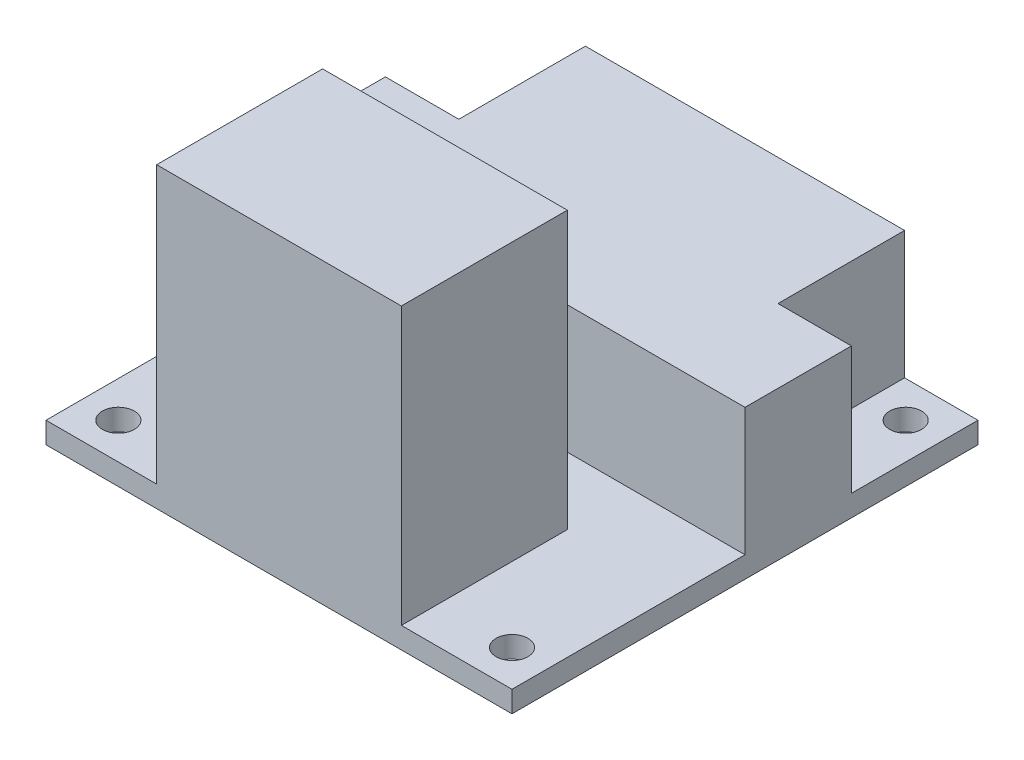
ISO-10303-21;
HEADER;
FILE_DESCRIPTION(('STEP AP214'),'2;1');
FILE_NAME('part.step','',(''),(''),'','','');
FILE_SCHEMA(('AUTOMOTIVE_DESIGN { 1 0 10303 214 1 1 1 1 }'));
ENDSEC;
DATA;
#1=APPLICATION_CONTEXT('core data for automotive mechanical design processes');
#2=APPLICATION_PROTOCOL_DEFINITION('international standard','automotive_design',2000,#1);
#3=PRODUCT_CONTEXT('',#1,'mechanical');
#4=PRODUCT('Part','Part','',(#3));
#5=PRODUCT_RELATED_PRODUCT_CATEGORY('part','',(#4));
#6=PRODUCT_DEFINITION_FORMATION('','',#4);
#7=PRODUCT_DEFINITION_CONTEXT('part definition',#1,'design');
#8=PRODUCT_DEFINITION('design','',#6,#7);
#9=PRODUCT_DEFINITION_SHAPE('','',#8);
#10=(LENGTH_UNIT() NAMED_UNIT(*) SI_UNIT(.MILLI.,.METRE.));
#11=(NAMED_UNIT(*) PLANE_ANGLE_UNIT() SI_UNIT($,.RADIAN.));
#12=(NAMED_UNIT(*) SI_UNIT($,.STERADIAN.) SOLID_ANGLE_UNIT());
#13=UNCERTAINTY_MEASURE_WITH_UNIT(LENGTH_MEASURE(1.E-05),#10,'distance_accuracy_value','');
#14=(GEOMETRIC_REPRESENTATION_CONTEXT(3) GLOBAL_UNCERTAINTY_ASSIGNED_CONTEXT((#13)) GLOBAL_UNIT_ASSIGNED_CONTEXT((#10,
#11,#12)) REPRESENTATION_CONTEXT('',''));
#15=CARTESIAN_POINT('',(0.,0.,0.));
#16=DIRECTION('',(0.,0.,1.));
#17=DIRECTION('',(1.,0.,0.));
#18=AXIS2_PLACEMENT_3D('',#15,#16,#17);
#19=CARTESIAN_POINT('',(0.,2.,0.));
#20=DIRECTION('',(0.,-1.,0.));
#21=DIRECTION('',(0.,0.,-1.));
#22=AXIS2_PLACEMENT_3D('',#19,#20,#21);
#23=PLANE('',#22);
#24=CARTESIAN_POINT('',(-18.5,2.,18.5));
#25=DIRECTION('',(0.,1.,0.));
#26=DIRECTION('',(0.,0.,1.));
#27=AXIS2_PLACEMENT_3D('',#24,#25,#26);
#28=CIRCLE('',#27,1.5);
#29=CARTESIAN_POINT('',(-18.5,2.,20.));
#30=VERTEX_POINT('',#29);
#31=EDGE_CURVE('E215',#30,#30,#28,.T.);
#32=ORIENTED_EDGE('',*,*,#31,.F.);
#33=EDGE_LOOP('',(#32));
#34=FACE_BOUND('',#33,.T.);
#35=CARTESIAN_POINT('',(18.5,2.,18.5));
#36=DIRECTION('',(0.,1.,0.));
#37=DIRECTION('',(0.,0.,1.));
#38=AXIS2_PLACEMENT_3D('',#35,#36,#37);
#39=CIRCLE('',#38,1.5);
#40=CARTESIAN_POINT('',(18.5,2.,20.));
#41=VERTEX_POINT('',#40);
#42=EDGE_CURVE('E209',#41,#41,#39,.T.);
#43=ORIENTED_EDGE('',*,*,#42,.F.);
#44=EDGE_LOOP('',(#43));
#45=FACE_BOUND('',#44,.T.);
#46=DIRECTION('',(1.,0.,0.));
#47=VECTOR('',#46,1.);
#48=CARTESIAN_POINT('',(0.,2.,0.));
#49=LINE('',#48,#47);
#50=CARTESIAN_POINT('',(-21.9,2.,0.));
#51=VERTEX_POINT('',#50);
#52=CARTESIAN_POINT('',(21.9,2.,0.));
#53=VERTEX_POINT('',#52);
#54=EDGE_CURVE('E277',#51,#53,#49,.T.);
#55=ORIENTED_EDGE('',*,*,#54,.F.);
#56=DIRECTION('',(0.,0.,1.));
#57=VECTOR('',#56,1.);
#58=CARTESIAN_POINT('',(-21.9,2.,21.9));
#59=LINE('',#58,#57);
#60=CARTESIAN_POINT('',(-21.9,2.,21.9));
#61=VERTEX_POINT('',#60);
#62=EDGE_CURVE('E171',#51,#61,#59,.T.);
#63=ORIENTED_EDGE('',*,*,#62,.T.);
#64=DIRECTION('',(1.,0.,0.));
#65=VECTOR('',#64,1.);
#66=CARTESIAN_POINT('',(-21.9,2.,21.9));
#67=LINE('',#66,#65);
#68=CARTESIAN_POINT('',(-11.5,2.,21.9));
#69=VERTEX_POINT('',#68);
#70=EDGE_CURVE('E242',#61,#69,#67,.T.);
#71=ORIENTED_EDGE('',*,*,#70,.T.);
#72=DIRECTION('',(0.,0.,1.));
#73=VECTOR('',#72,1.);
#74=CARTESIAN_POINT('',(-11.5,2.,21.9));
#75=LINE('',#74,#73);
#76=CARTESIAN_POINT('',(-11.5,2.,6.3));
#77=VERTEX_POINT('',#76);
#78=EDGE_CURVE('E186',#77,#69,#75,.T.);
#79=ORIENTED_EDGE('',*,*,#78,.F.);
#80=DIRECTION('',(-1.,0.,0.));
#81=VECTOR('',#80,1.);
#82=CARTESIAN_POINT('',(-11.5,2.,6.3));
#83=LINE('',#82,#81);
#84=CARTESIAN_POINT('',(11.5,2.,6.3));
#85=VERTEX_POINT('',#84);
#86=EDGE_CURVE('E176',#85,#77,#83,.T.);
#87=ORIENTED_EDGE('',*,*,#86,.F.);
#88=DIRECTION('',(0.,0.,-1.));
#89=VECTOR('',#88,1.);
#90=CARTESIAN_POINT('',(11.5,2.,21.9));
#91=LINE('',#90,#89);
#92=CARTESIAN_POINT('',(11.5,2.,21.9));
#93=VERTEX_POINT('',#92);
#94=EDGE_CURVE('E173',#93,#85,#91,.T.);
#95=ORIENTED_EDGE('',*,*,#94,.F.);
#96=CARTESIAN_POINT('',(21.9,2.,21.9));
#97=VERTEX_POINT('',#96);
#98=EDGE_CURVE('E241',#93,#97,#67,.T.);
#99=ORIENTED_EDGE('',*,*,#98,.T.);
#100=DIRECTION('',(0.,0.,-1.));
#101=VECTOR('',#100,1.);
#102=CARTESIAN_POINT('',(21.9,2.,21.9));
#103=LINE('',#102,#101);
#104=EDGE_CURVE('E233',#97,#53,#103,.T.);
#105=ORIENTED_EDGE('',*,*,#104,.T.);
#106=EDGE_LOOP('',(#55,#63,#71,#79,#87,#95,#99,#105));
#107=FACE_BOUND('',#106,.T.);
#108=ADVANCED_FACE('F34',(#34,#45,#107),#23,.F.);
#109=CARTESIAN_POINT('',(18.5,2.,-18.5));
#110=DIRECTION('',(0.,1.,0.));
#111=DIRECTION('',(0.,0.,1.));
#112=AXIS2_PLACEMENT_3D('',#109,#110,#111);
#113=CIRCLE('',#112,1.5);
#114=CARTESIAN_POINT('',(18.5,2.,-17.));
#115=VERTEX_POINT('',#114);
#116=EDGE_CURVE('E227',#115,#115,#113,.T.);
#117=ORIENTED_EDGE('',*,*,#116,.F.);
#118=EDGE_LOOP('',(#117));
#119=FACE_BOUND('',#118,.T.);
#120=DIRECTION('',(0.,0.,-1.));
#121=VECTOR('',#120,1.);
#122=CARTESIAN_POINT('',(15.,2.,0.));
#123=LINE('',#122,#121);
#124=CARTESIAN_POINT('',(15.,2.,-10.));
#125=VERTEX_POINT('',#124);
#126=CARTESIAN_POINT('',(15.,2.,-21.9));
#127=VERTEX_POINT('',#126);
#128=EDGE_CURVE('E49',#125,#127,#123,.T.);
#129=ORIENTED_EDGE('',*,*,#128,.F.);
#130=DIRECTION('',(1.,0.,0.));
#131=VECTOR('',#130,1.);
#132=CARTESIAN_POINT('',(0.,2.,-10.));
#133=LINE('',#132,#131);
#134=CARTESIAN_POINT('',(21.9,2.,-10.));
#135=VERTEX_POINT('',#134);
#136=EDGE_CURVE('E278',#125,#135,#133,.T.);
#137=ORIENTED_EDGE('',*,*,#136,.T.);
#138=CARTESIAN_POINT('',(21.9,2.,-21.9));
#139=VERTEX_POINT('',#138);
#140=EDGE_CURVE('E236',#135,#139,#103,.T.);
#141=ORIENTED_EDGE('',*,*,#140,.T.);
#142=DIRECTION('',(-1.,0.,0.));
#143=VECTOR('',#142,1.);
#144=CARTESIAN_POINT('',(-21.9,2.,-21.9));
#145=LINE('',#144,#143);
#146=EDGE_CURVE('E237',#139,#127,#145,.T.);
#147=ORIENTED_EDGE('',*,*,#146,.T.);
#148=EDGE_LOOP('',(#129,#137,#141,#147));
#149=FACE_BOUND('',#148,.T.);
#150=ADVANCED_FACE('F309',(#119,#149),#23,.F.);
#151=CARTESIAN_POINT('',(-18.5,2.,-18.5));
#152=DIRECTION('',(0.,1.,0.));
#153=DIRECTION('',(0.,0.,1.));
#154=AXIS2_PLACEMENT_3D('',#151,#152,#153);
#155=CIRCLE('',#154,1.5);
#156=CARTESIAN_POINT('',(-18.5,2.,-17.));
#157=VERTEX_POINT('',#156);
#158=EDGE_CURVE('E221',#157,#157,#155,.T.);
#159=ORIENTED_EDGE('',*,*,#158,.F.);
#160=EDGE_LOOP('',(#159));
#161=FACE_BOUND('',#160,.T.);
#162=DIRECTION('',(1.,0.,0.));
#163=VECTOR('',#162,1.);
#164=CARTESIAN_POINT('',(0.,2.,-10.));
#165=LINE('',#164,#163);
#166=CARTESIAN_POINT('',(-21.9,2.,-10.));
#167=VERTEX_POINT('',#166);
#168=CARTESIAN_POINT('',(-15.,2.,-10.));
#169=VERTEX_POINT('',#168);
#170=EDGE_CURVE('E57',#167,#169,#165,.T.);
#171=ORIENTED_EDGE('',*,*,#170,.T.);
#172=DIRECTION('',(0.,0.,-1.));
#173=VECTOR('',#172,1.);
#174=CARTESIAN_POINT('',(-15.,2.,0.));
#175=LINE('',#174,#173);
#176=CARTESIAN_POINT('',(-15.,2.,-21.9));
#177=VERTEX_POINT('',#176);
#178=EDGE_CURVE('E285',#169,#177,#175,.T.);
#179=ORIENTED_EDGE('',*,*,#178,.T.);
#180=CARTESIAN_POINT('',(-21.9,2.,-21.9));
#181=VERTEX_POINT('',#180);
#182=EDGE_CURVE('E235',#177,#181,#145,.T.);
#183=ORIENTED_EDGE('',*,*,#182,.T.);
#184=EDGE_CURVE('E239',#181,#167,#59,.T.);
#185=ORIENTED_EDGE('',*,*,#184,.T.);
#186=EDGE_LOOP('',(#171,#179,#183,#185));
#187=FACE_BOUND('',#186,.T.);
#188=ADVANCED_FACE('F330',(#161,#187),#23,.F.);
#189=CARTESIAN_POINT('',(0.,0.,0.));
#190=DIRECTION('',(0.,-1.,0.));
#191=DIRECTION('',(0.,0.,-1.));
#192=AXIS2_PLACEMENT_3D('',#189,#190,#191);
#193=PLANE('',#192);
#194=CARTESIAN_POINT('',(-18.5,0.,18.5));
#195=DIRECTION('',(0.,1.,0.));
#196=DIRECTION('',(0.,0.,1.));
#197=AXIS2_PLACEMENT_3D('',#194,#195,#196);
#198=CIRCLE('',#197,1.5);
#199=CARTESIAN_POINT('',(-18.5,0.,20.));
#200=VERTEX_POINT('',#199);
#201=EDGE_CURVE('E212',#200,#200,#198,.T.);
#202=ORIENTED_EDGE('',*,*,#201,.T.);
#203=EDGE_LOOP('',(#202));
#204=FACE_BOUND('',#203,.T.);
#205=CARTESIAN_POINT('',(18.5,0.,-18.5));
#206=DIRECTION('',(0.,1.,0.));
#207=DIRECTION('',(0.,0.,1.));
#208=AXIS2_PLACEMENT_3D('',#205,#206,#207);
#209=CIRCLE('',#208,1.5);
#210=CARTESIAN_POINT('',(18.5,0.,-17.));
#211=VERTEX_POINT('',#210);
#212=EDGE_CURVE('E224',#211,#211,#209,.T.);
#213=ORIENTED_EDGE('',*,*,#212,.T.);
#214=EDGE_LOOP('',(#213));
#215=FACE_BOUND('',#214,.T.);
#216=DIRECTION('',(0.,0.,-1.));
#217=VECTOR('',#216,1.);
#218=CARTESIAN_POINT('',(21.9,0.,21.9));
#219=LINE('',#218,#217);
#220=CARTESIAN_POINT('',(21.9,0.,21.9));
#221=VERTEX_POINT('',#220);
#222=CARTESIAN_POINT('',(21.9,0.,-21.9));
#223=VERTEX_POINT('',#222);
#224=EDGE_CURVE('E230',#221,#223,#219,.T.);
#225=ORIENTED_EDGE('',*,*,#224,.F.);
#226=DIRECTION('',(1.,0.,0.));
#227=VECTOR('',#226,1.);
#228=CARTESIAN_POINT('',(-21.9,0.,21.9));
#229=LINE('',#228,#227);
#230=CARTESIAN_POINT('',(-21.9,0.,21.9));
#231=VERTEX_POINT('',#230);
#232=EDGE_CURVE('E251',#231,#221,#229,.T.);
#233=ORIENTED_EDGE('',*,*,#232,.F.);
#234=DIRECTION('',(0.,0.,1.));
#235=VECTOR('',#234,1.);
#236=CARTESIAN_POINT('',(-21.9,0.,21.9));
#237=LINE('',#236,#235);
#238=CARTESIAN_POINT('',(-21.9,0.,-21.9));
#239=VERTEX_POINT('',#238);
#240=EDGE_CURVE('E249',#239,#231,#237,.T.);
#241=ORIENTED_EDGE('',*,*,#240,.F.);
#242=DIRECTION('',(-1.,0.,0.));
#243=VECTOR('',#242,1.);
#244=CARTESIAN_POINT('',(-21.9,0.,-21.9));
#245=LINE('',#244,#243);
#246=EDGE_CURVE('E247',#223,#239,#245,.T.);
#247=ORIENTED_EDGE('',*,*,#246,.F.);
#248=EDGE_LOOP('',(#225,#233,#241,#247));
#249=FACE_BOUND('',#248,.T.);
#250=CARTESIAN_POINT('',(-18.5,0.,-18.5));
#251=DIRECTION('',(0.,1.,0.));
#252=DIRECTION('',(0.,0.,1.));
#253=AXIS2_PLACEMENT_3D('',#250,#251,#252);
#254=CIRCLE('',#253,1.5);
#255=CARTESIAN_POINT('',(-18.5,0.,-17.));
#256=VERTEX_POINT('',#255);
#257=EDGE_CURVE('E218',#256,#256,#254,.T.);
#258=ORIENTED_EDGE('',*,*,#257,.T.);
#259=EDGE_LOOP('',(#258));
#260=FACE_BOUND('',#259,.T.);
#261=CARTESIAN_POINT('',(18.5,0.,18.5));
#262=DIRECTION('',(0.,1.,0.));
#263=DIRECTION('',(0.,0.,1.));
#264=AXIS2_PLACEMENT_3D('',#261,#262,#263);
#265=CIRCLE('',#264,1.5);
#266=CARTESIAN_POINT('',(18.5,0.,20.));
#267=VERTEX_POINT('',#266);
#268=EDGE_CURVE('E208',#267,#267,#265,.T.);
#269=ORIENTED_EDGE('',*,*,#268,.T.);
#270=EDGE_LOOP('',(#269));
#271=FACE_BOUND('',#270,.T.);
#272=ADVANCED_FACE('F266',(#204,#215,#249,#260,#271),#193,.T.);
#273=CARTESIAN_POINT('',(21.9,2.,21.9));
#274=DIRECTION('',(-1.,0.,0.));
#275=DIRECTION('',(0.,0.,1.));
#276=AXIS2_PLACEMENT_3D('',#273,#274,#275);
#277=PLANE('',#276);
#278=ORIENTED_EDGE('',*,*,#224,.T.);
#279=DIRECTION('',(0.,-1.,0.));
#280=VECTOR('',#279,1.);
#281=CARTESIAN_POINT('',(21.9,2.,-21.9));
#282=LINE('',#281,#280);
#283=EDGE_CURVE('E11',#139,#223,#282,.T.);
#284=ORIENTED_EDGE('',*,*,#283,.F.);
#285=ORIENTED_EDGE('',*,*,#140,.F.);
#286=DIRECTION('',(0.,-1.,0.));
#287=VECTOR('',#286,1.);
#288=CARTESIAN_POINT('',(21.9,14.,-10.));
#289=LINE('',#288,#287);
#290=CARTESIAN_POINT('',(21.9,14.,-10.));
#291=VERTEX_POINT('',#290);
#292=EDGE_CURVE('E178',#291,#135,#289,.T.);
#293=ORIENTED_EDGE('',*,*,#292,.F.);
#294=DIRECTION('',(0.,0.,-1.));
#295=VECTOR('',#294,1.);
#296=CARTESIAN_POINT('',(21.9,14.,0.));
#297=LINE('',#296,#295);
#298=CARTESIAN_POINT('',(21.9,14.,0.));
#299=VERTEX_POINT('',#298);
#300=EDGE_CURVE('E157',#299,#291,#297,.T.);
#301=ORIENTED_EDGE('',*,*,#300,.F.);
#302=DIRECTION('',(0.,-1.,0.));
#303=VECTOR('',#302,1.);
#304=CARTESIAN_POINT('',(21.9,14.,0.));
#305=LINE('',#304,#303);
#306=EDGE_CURVE('E154',#299,#53,#305,.T.);
#307=ORIENTED_EDGE('',*,*,#306,.T.);
#308=ORIENTED_EDGE('',*,*,#104,.F.);
#309=DIRECTION('',(0.,-1.,0.));
#310=VECTOR('',#309,1.);
#311=CARTESIAN_POINT('',(21.9,2.,21.9));
#312=LINE('',#311,#310);
#313=EDGE_CURVE('E244',#97,#221,#312,.T.);
#314=ORIENTED_EDGE('',*,*,#313,.T.);
#315=EDGE_LOOP('',(#278,#284,#285,#293,#301,#307,#308,#314));
#316=FACE_BOUND('',#315,.T.);
#317=ADVANCED_FACE('F36',(#316),#277,.F.);
#318=CARTESIAN_POINT('',(-21.9,2.,-21.9));
#319=DIRECTION('',(0.,0.,1.));
#320=DIRECTION('',(1.,0.,0.));
#321=AXIS2_PLACEMENT_3D('',#318,#319,#320);
#322=PLANE('',#321);
#323=ORIENTED_EDGE('',*,*,#246,.T.);
#324=DIRECTION('',(0.,-1.,0.));
#325=VECTOR('',#324,1.);
#326=CARTESIAN_POINT('',(-21.9,2.,-21.9));
#327=LINE('',#326,#325);
#328=EDGE_CURVE('E42',#181,#239,#327,.T.);
#329=ORIENTED_EDGE('',*,*,#328,.F.);
#330=ORIENTED_EDGE('',*,*,#182,.F.);
#331=DIRECTION('',(0.,-1.,0.));
#332=VECTOR('',#331,1.);
#333=CARTESIAN_POINT('',(-15.,14.,-21.9));
#334=LINE('',#333,#332);
#335=CARTESIAN_POINT('',(-15.,14.,-21.9));
#336=VERTEX_POINT('',#335);
#337=EDGE_CURVE('E292',#336,#177,#334,.T.);
#338=ORIENTED_EDGE('',*,*,#337,.F.);
#339=DIRECTION('',(-1.,0.,0.));
#340=VECTOR('',#339,1.);
#341=CARTESIAN_POINT('',(0.,14.,-21.9));
#342=LINE('',#341,#340);
#343=CARTESIAN_POINT('',(15.,14.,-21.9));
#344=VERTEX_POINT('',#343);
#345=EDGE_CURVE('E314',#344,#336,#342,.T.);
#346=ORIENTED_EDGE('',*,*,#345,.F.);
#347=DIRECTION('',(0.,-1.,0.));
#348=VECTOR('',#347,1.);
#349=CARTESIAN_POINT('',(15.,14.,-21.9));
#350=LINE('',#349,#348);
#351=EDGE_CURVE('E295',#344,#127,#350,.T.);
#352=ORIENTED_EDGE('',*,*,#351,.T.);
#353=ORIENTED_EDGE('',*,*,#146,.F.);
#354=ORIENTED_EDGE('',*,*,#283,.T.);
#355=EDGE_LOOP('',(#323,#329,#330,#338,#346,#352,#353,#354));
#356=FACE_BOUND('',#355,.T.);
#357=ADVANCED_FACE('F310',(#356),#322,.F.);
#358=CARTESIAN_POINT('',(-21.9,2.,21.9));
#359=DIRECTION('',(1.,0.,0.));
#360=DIRECTION('',(0.,0.,-1.));
#361=AXIS2_PLACEMENT_3D('',#358,#359,#360);
#362=PLANE('',#361);
#363=ORIENTED_EDGE('',*,*,#240,.T.);
#364=DIRECTION('',(0.,-1.,0.));
#365=VECTOR('',#364,1.);
#366=CARTESIAN_POINT('',(-21.9,2.,21.9));
#367=LINE('',#366,#365);
#368=EDGE_CURVE('E255',#61,#231,#367,.T.);
#369=ORIENTED_EDGE('',*,*,#368,.F.);
#370=ORIENTED_EDGE('',*,*,#62,.F.);
#371=DIRECTION('',(0.,-1.,0.));
#372=VECTOR('',#371,1.);
#373=CARTESIAN_POINT('',(-21.9,14.,0.));
#374=LINE('',#373,#372);
#375=CARTESIAN_POINT('',(-21.9,14.,0.));
#376=VERTEX_POINT('',#375);
#377=EDGE_CURVE('E152',#376,#51,#374,.T.);
#378=ORIENTED_EDGE('',*,*,#377,.F.);
#379=DIRECTION('',(0.,0.,1.));
#380=VECTOR('',#379,1.);
#381=CARTESIAN_POINT('',(-21.9,14.,0.));
#382=LINE('',#381,#380);
#383=CARTESIAN_POINT('',(-21.9,14.,-10.));
#384=VERTEX_POINT('',#383);
#385=EDGE_CURVE('E158',#384,#376,#382,.T.);
#386=ORIENTED_EDGE('',*,*,#385,.F.);
#387=DIRECTION('',(0.,-1.,0.));
#388=VECTOR('',#387,1.);
#389=CARTESIAN_POINT('',(-21.9,14.,-10.));
#390=LINE('',#389,#388);
#391=EDGE_CURVE('E288',#384,#167,#390,.T.);
#392=ORIENTED_EDGE('',*,*,#391,.T.);
#393=ORIENTED_EDGE('',*,*,#184,.F.);
#394=ORIENTED_EDGE('',*,*,#328,.T.);
#395=EDGE_LOOP('',(#363,#369,#370,#378,#386,#392,#393,#394));
#396=FACE_BOUND('',#395,.T.);
#397=ADVANCED_FACE('F169',(#396),#362,.F.);
#398=CARTESIAN_POINT('',(-21.9,2.,21.9));
#399=DIRECTION('',(0.,0.,-1.));
#400=DIRECTION('',(-1.,0.,0.));
#401=AXIS2_PLACEMENT_3D('',#398,#399,#400);
#402=PLANE('',#401);
#403=ORIENTED_EDGE('',*,*,#232,.T.);
#404=ORIENTED_EDGE('',*,*,#313,.F.);
#405=ORIENTED_EDGE('',*,*,#98,.F.);
#406=DIRECTION('',(0.,-1.,0.));
#407=VECTOR('',#406,1.);
#408=CARTESIAN_POINT('',(11.5,28.,21.9));
#409=LINE('',#408,#407);
#410=CARTESIAN_POINT('',(11.5,28.,21.9));
#411=VERTEX_POINT('',#410);
#412=EDGE_CURVE('E191',#411,#93,#409,.T.);
#413=ORIENTED_EDGE('',*,*,#412,.F.);
#414=DIRECTION('',(1.,0.,0.));
#415=VECTOR('',#414,1.);
#416=CARTESIAN_POINT('',(-11.5,28.,21.9));
#417=LINE('',#416,#415);
#418=CARTESIAN_POINT('',(-11.5,28.,21.9));
#419=VERTEX_POINT('',#418);
#420=EDGE_CURVE('E190',#419,#411,#417,.T.);
#421=ORIENTED_EDGE('',*,*,#420,.F.);
#422=DIRECTION('',(0.,-1.,0.));
#423=VECTOR('',#422,1.);
#424=CARTESIAN_POINT('',(-11.5,28.,21.9));
#425=LINE('',#424,#423);
#426=EDGE_CURVE('E199',#419,#69,#425,.T.);
#427=ORIENTED_EDGE('',*,*,#426,.T.);
#428=ORIENTED_EDGE('',*,*,#70,.F.);
#429=ORIENTED_EDGE('',*,*,#368,.T.);
#430=EDGE_LOOP('',(#403,#404,#405,#413,#421,#427,#428,#429));
#431=FACE_BOUND('',#430,.T.);
#432=ADVANCED_FACE('F270',(#431),#402,.F.);
#433=CARTESIAN_POINT('',(18.5,2.,-18.5));
#434=DIRECTION('',(0.,-1.,0.));
#435=DIRECTION('',(0.,0.,-1.));
#436=AXIS2_PLACEMENT_3D('',#433,#434,#435);
#437=CYLINDRICAL_SURFACE('',#436,1.5);
#438=ORIENTED_EDGE('',*,*,#116,.T.);
#439=EDGE_LOOP('',(#438));
#440=FACE_BOUND('',#439,.T.);
#441=ORIENTED_EDGE('',*,*,#212,.F.);
#442=EDGE_LOOP('',(#441));
#443=FACE_BOUND('',#442,.T.);
#444=ADVANCED_FACE('F372',(#440,#443),#437,.F.);
#445=CARTESIAN_POINT('',(-18.5,2.,-18.5));
#446=DIRECTION('',(0.,-1.,0.));
#447=DIRECTION('',(0.,0.,-1.));
#448=AXIS2_PLACEMENT_3D('',#445,#446,#447);
#449=CYLINDRICAL_SURFACE('',#448,1.5);
#450=ORIENTED_EDGE('',*,*,#158,.T.);
#451=EDGE_LOOP('',(#450));
#452=FACE_BOUND('',#451,.T.);
#453=ORIENTED_EDGE('',*,*,#257,.F.);
#454=EDGE_LOOP('',(#453));
#455=FACE_BOUND('',#454,.T.);
#456=ADVANCED_FACE('F366',(#452,#455),#449,.F.);
#457=CARTESIAN_POINT('',(-18.5,2.,18.5));
#458=DIRECTION('',(0.,-1.,0.));
#459=DIRECTION('',(0.,0.,-1.));
#460=AXIS2_PLACEMENT_3D('',#457,#458,#459);
#461=CYLINDRICAL_SURFACE('',#460,1.5);
#462=ORIENTED_EDGE('',*,*,#31,.T.);
#463=EDGE_LOOP('',(#462));
#464=FACE_BOUND('',#463,.T.);
#465=ORIENTED_EDGE('',*,*,#201,.F.);
#466=EDGE_LOOP('',(#465));
#467=FACE_BOUND('',#466,.T.);
#468=ADVANCED_FACE('F355',(#464,#467),#461,.F.);
#469=CARTESIAN_POINT('',(18.5,2.,18.5));
#470=DIRECTION('',(0.,-1.,0.));
#471=DIRECTION('',(0.,0.,-1.));
#472=AXIS2_PLACEMENT_3D('',#469,#470,#471);
#473=CYLINDRICAL_SURFACE('',#472,1.5);
#474=ORIENTED_EDGE('',*,*,#42,.T.);
#475=EDGE_LOOP('',(#474));
#476=FACE_BOUND('',#475,.T.);
#477=ORIENTED_EDGE('',*,*,#268,.F.);
#478=EDGE_LOOP('',(#477));
#479=FACE_BOUND('',#478,.T.);
#480=ADVANCED_FACE('F351',(#476,#479),#473,.F.);
#481=CARTESIAN_POINT('',(11.5,28.,21.9));
#482=DIRECTION('',(-1.,0.,0.));
#483=DIRECTION('',(0.,0.,1.));
#484=AXIS2_PLACEMENT_3D('',#481,#482,#483);
#485=PLANE('',#484);
#486=ORIENTED_EDGE('',*,*,#94,.T.);
#487=DIRECTION('',(0.,-1.,0.));
#488=VECTOR('',#487,1.);
#489=CARTESIAN_POINT('',(11.5,28.,6.3));
#490=LINE('',#489,#488);
#491=CARTESIAN_POINT('',(11.5,28.,6.3));
#492=VERTEX_POINT('',#491);
#493=EDGE_CURVE('E205',#492,#85,#490,.T.);
#494=ORIENTED_EDGE('',*,*,#493,.F.);
#495=DIRECTION('',(0.,0.,-1.));
#496=VECTOR('',#495,1.);
#497=CARTESIAN_POINT('',(11.5,28.,21.9));
#498=LINE('',#497,#496);
#499=EDGE_CURVE('E182',#411,#492,#498,.T.);
#500=ORIENTED_EDGE('',*,*,#499,.F.);
#501=ORIENTED_EDGE('',*,*,#412,.T.);
#502=EDGE_LOOP('',(#486,#494,#500,#501));
#503=FACE_BOUND('',#502,.T.);
#504=ADVANCED_FACE('F354',(#503),#485,.F.);
#505=CARTESIAN_POINT('',(-11.5,28.,6.3));
#506=DIRECTION('',(0.,0.,1.));
#507=DIRECTION('',(1.,0.,0.));
#508=AXIS2_PLACEMENT_3D('',#505,#506,#507);
#509=PLANE('',#508);
#510=ORIENTED_EDGE('',*,*,#86,.T.);
#511=DIRECTION('',(0.,-1.,0.));
#512=VECTOR('',#511,1.);
#513=CARTESIAN_POINT('',(-11.5,28.,6.3));
#514=LINE('',#513,#512);
#515=CARTESIAN_POINT('',(-11.5,28.,6.3));
#516=VERTEX_POINT('',#515);
#517=EDGE_CURVE('E202',#516,#77,#514,.T.);
#518=ORIENTED_EDGE('',*,*,#517,.F.);
#519=DIRECTION('',(-1.,0.,0.));
#520=VECTOR('',#519,1.);
#521=CARTESIAN_POINT('',(-11.5,28.,6.3));
#522=LINE('',#521,#520);
#523=EDGE_CURVE('E185',#492,#516,#522,.T.);
#524=ORIENTED_EDGE('',*,*,#523,.F.);
#525=ORIENTED_EDGE('',*,*,#493,.T.);
#526=EDGE_LOOP('',(#510,#518,#524,#525));
#527=FACE_BOUND('',#526,.T.);
#528=ADVANCED_FACE('F363',(#527),#509,.F.);
#529=CARTESIAN_POINT('',(-11.5,28.,21.9));
#530=DIRECTION('',(1.,0.,0.));
#531=DIRECTION('',(0.,0.,-1.));
#532=AXIS2_PLACEMENT_3D('',#529,#530,#531);
#533=PLANE('',#532);
#534=ORIENTED_EDGE('',*,*,#78,.T.);
#535=ORIENTED_EDGE('',*,*,#426,.F.);
#536=DIRECTION('',(0.,0.,1.));
#537=VECTOR('',#536,1.);
#538=CARTESIAN_POINT('',(-11.5,28.,21.9));
#539=LINE('',#538,#537);
#540=EDGE_CURVE('E188',#516,#419,#539,.T.);
#541=ORIENTED_EDGE('',*,*,#540,.F.);
#542=ORIENTED_EDGE('',*,*,#517,.T.);
#543=EDGE_LOOP('',(#534,#535,#541,#542));
#544=FACE_BOUND('',#543,.T.);
#545=ADVANCED_FACE('F440',(#544),#533,.F.);
#546=CARTESIAN_POINT('',(0.,28.,0.));
#547=DIRECTION('',(0.,-1.,0.));
#548=DIRECTION('',(0.,0.,-1.));
#549=AXIS2_PLACEMENT_3D('',#546,#547,#548);
#550=PLANE('',#549);
#551=ORIENTED_EDGE('',*,*,#499,.T.);
#552=ORIENTED_EDGE('',*,*,#523,.T.);
#553=ORIENTED_EDGE('',*,*,#540,.T.);
#554=ORIENTED_EDGE('',*,*,#420,.T.);
#555=EDGE_LOOP('',(#551,#552,#553,#554));
#556=FACE_BOUND('',#555,.T.);
#557=ADVANCED_FACE('F449',(#556),#550,.F.);
#558=CARTESIAN_POINT('',(0.,14.,0.));
#559=DIRECTION('',(0.,0.,-1.));
#560=DIRECTION('',(-1.,0.,0.));
#561=AXIS2_PLACEMENT_3D('',#558,#559,#560);
#562=PLANE('',#561);
#563=ORIENTED_EDGE('',*,*,#54,.T.);
#564=ORIENTED_EDGE('',*,*,#306,.F.);
#565=DIRECTION('',(1.,0.,0.));
#566=VECTOR('',#565,1.);
#567=CARTESIAN_POINT('',(0.,14.,0.));
#568=LINE('',#567,#566);
#569=EDGE_CURVE('E147',#376,#299,#568,.T.);
#570=ORIENTED_EDGE('',*,*,#569,.F.);
#571=ORIENTED_EDGE('',*,*,#377,.T.);
#572=EDGE_LOOP('',(#563,#564,#570,#571));
#573=FACE_BOUND('',#572,.T.);
#574=ADVANCED_FACE('F150',(#573),#562,.F.);
#575=CARTESIAN_POINT('',(0.,14.,-10.));
#576=DIRECTION('',(0.,0.,-1.));
#577=DIRECTION('',(-1.,0.,0.));
#578=AXIS2_PLACEMENT_3D('',#575,#576,#577);
#579=PLANE('',#578);
#580=ORIENTED_EDGE('',*,*,#136,.F.);
#581=DIRECTION('',(0.,-1.,0.));
#582=VECTOR('',#581,1.);
#583=CARTESIAN_POINT('',(15.,14.,-10.));
#584=LINE('',#583,#582);
#585=CARTESIAN_POINT('',(15.,14.,-10.));
#586=VERTEX_POINT('',#585);
#587=EDGE_CURVE('E298',#586,#125,#584,.T.);
#588=ORIENTED_EDGE('',*,*,#587,.F.);
#589=DIRECTION('',(1.,0.,0.));
#590=VECTOR('',#589,1.);
#591=CARTESIAN_POINT('',(0.,14.,-10.));
#592=LINE('',#591,#590);
#593=EDGE_CURVE('E306',#586,#291,#592,.T.);
#594=ORIENTED_EDGE('',*,*,#593,.T.);
#595=ORIENTED_EDGE('',*,*,#292,.T.);
#596=EDGE_LOOP('',(#580,#588,#594,#595));
#597=FACE_BOUND('',#596,.T.);
#598=ADVANCED_FACE('F304',(#597),#579,.T.);
#599=CARTESIAN_POINT('',(15.,14.,0.));
#600=DIRECTION('',(-1.,0.,0.));
#601=DIRECTION('',(0.,0.,1.));
#602=AXIS2_PLACEMENT_3D('',#599,#600,#601);
#603=PLANE('',#602);
#604=ORIENTED_EDGE('',*,*,#128,.T.);
#605=ORIENTED_EDGE('',*,*,#351,.F.);
#606=DIRECTION('',(0.,0.,-1.));
#607=VECTOR('',#606,1.);
#608=CARTESIAN_POINT('',(15.,14.,0.));
#609=LINE('',#608,#607);
#610=EDGE_CURVE('E318',#586,#344,#609,.T.);
#611=ORIENTED_EDGE('',*,*,#610,.F.);
#612=ORIENTED_EDGE('',*,*,#587,.T.);
#613=EDGE_LOOP('',(#604,#605,#611,#612));
#614=FACE_BOUND('',#613,.T.);
#615=ADVANCED_FACE('F317',(#614),#603,.F.);
#616=CARTESIAN_POINT('',(-15.,14.,0.));
#617=DIRECTION('',(-1.,0.,0.));
#618=DIRECTION('',(0.,0.,1.));
#619=AXIS2_PLACEMENT_3D('',#616,#617,#618);
#620=PLANE('',#619);
#621=ORIENTED_EDGE('',*,*,#178,.F.);
#622=DIRECTION('',(0.,-1.,0.));
#623=VECTOR('',#622,1.);
#624=CARTESIAN_POINT('',(-15.,14.,-10.));
#625=LINE('',#624,#623);
#626=CARTESIAN_POINT('',(-15.,14.,-10.));
#627=VERTEX_POINT('',#626);
#628=EDGE_CURVE('E290',#627,#169,#625,.T.);
#629=ORIENTED_EDGE('',*,*,#628,.F.);
#630=DIRECTION('',(0.,0.,-1.));
#631=VECTOR('',#630,1.);
#632=CARTESIAN_POINT('',(-15.,14.,0.));
#633=LINE('',#632,#631);
#634=EDGE_CURVE('E323',#627,#336,#633,.T.);
#635=ORIENTED_EDGE('',*,*,#634,.T.);
#636=ORIENTED_EDGE('',*,*,#337,.T.);
#637=EDGE_LOOP('',(#621,#629,#635,#636));
#638=FACE_BOUND('',#637,.T.);
#639=ADVANCED_FACE('F329',(#638),#620,.T.);
#640=CARTESIAN_POINT('',(0.,14.,-10.));
#641=DIRECTION('',(0.,0.,-1.));
#642=DIRECTION('',(-1.,0.,0.));
#643=AXIS2_PLACEMENT_3D('',#640,#641,#642);
#644=PLANE('',#643);
#645=ORIENTED_EDGE('',*,*,#170,.F.);
#646=ORIENTED_EDGE('',*,*,#391,.F.);
#647=DIRECTION('',(1.,0.,0.));
#648=VECTOR('',#647,1.);
#649=CARTESIAN_POINT('',(0.,14.,-10.));
#650=LINE('',#649,#648);
#651=EDGE_CURVE('E165',#384,#627,#650,.T.);
#652=ORIENTED_EDGE('',*,*,#651,.T.);
#653=ORIENTED_EDGE('',*,*,#628,.T.);
#654=EDGE_LOOP('',(#645,#646,#652,#653));
#655=FACE_BOUND('',#654,.T.);
#656=ADVANCED_FACE('F327',(#655),#644,.T.);
#657=CARTESIAN_POINT('',(0.,14.,0.));
#658=DIRECTION('',(0.,1.,0.));
#659=DIRECTION('',(0.,0.,1.));
#660=AXIS2_PLACEMENT_3D('',#657,#658,#659);
#661=PLANE('',#660);
#662=ORIENTED_EDGE('',*,*,#385,.T.);
#663=ORIENTED_EDGE('',*,*,#569,.T.);
#664=ORIENTED_EDGE('',*,*,#300,.T.);
#665=ORIENTED_EDGE('',*,*,#593,.F.);
#666=ORIENTED_EDGE('',*,*,#610,.T.);
#667=ORIENTED_EDGE('',*,*,#345,.T.);
#668=ORIENTED_EDGE('',*,*,#634,.F.);
#669=ORIENTED_EDGE('',*,*,#651,.F.);
#670=EDGE_LOOP('',(#662,#663,#664,#665,#666,#667,#668,#669));
#671=FACE_BOUND('',#670,.T.);
#672=ADVANCED_FACE('F162',(#671),#661,.T.);
#673=CLOSED_SHELL('',(#108,#150,#188,#272,#317,#357,#397,#432,#444,#456,#468,#480,#504,#528,
#545,#557,#574,#598,#615,#639,#656,#672));
#674=MANIFOLD_SOLID_BREP('B2',#673);
#675=ADVANCED_BREP_SHAPE_REPRESENTATION('',(#18,#674),#14);
#676=SHAPE_DEFINITION_REPRESENTATION(#9,#675);
ENDSEC;
END-ISO-10303-21;
